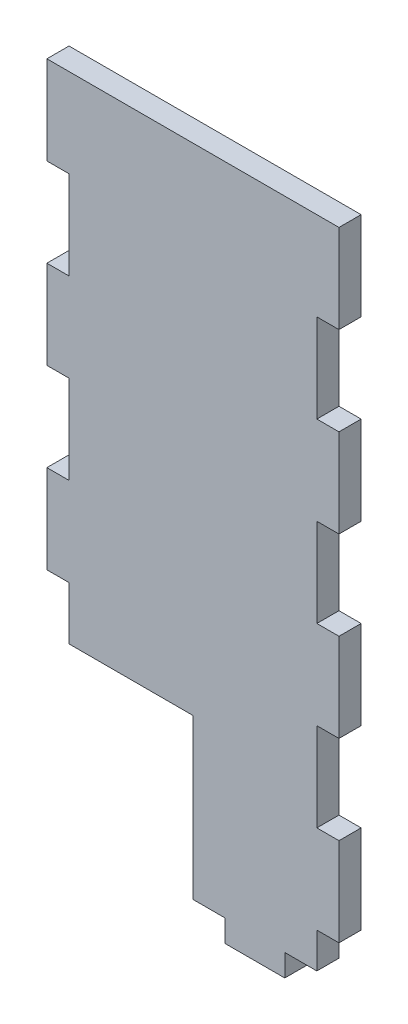
ISO-10303-21;
HEADER;
FILE_DESCRIPTION(('STEP AP214'),'2;1');
FILE_NAME('part.step','',(''),(''),'','','');
FILE_SCHEMA(('AUTOMOTIVE_DESIGN { 1 0 10303 214 1 1 1 1 }'));
ENDSEC;
DATA;
#1=APPLICATION_CONTEXT('core data for automotive mechanical design processes');
#2=APPLICATION_PROTOCOL_DEFINITION('international standard','automotive_design',2000,#1);
#3=PRODUCT_CONTEXT('',#1,'mechanical');
#4=PRODUCT('Part','Part','',(#3));
#5=PRODUCT_RELATED_PRODUCT_CATEGORY('part','',(#4));
#6=PRODUCT_DEFINITION_FORMATION('','',#4);
#7=PRODUCT_DEFINITION_CONTEXT('part definition',#1,'design');
#8=PRODUCT_DEFINITION('design','',#6,#7);
#9=PRODUCT_DEFINITION_SHAPE('','',#8);
#10=(LENGTH_UNIT() NAMED_UNIT(*) SI_UNIT(.MILLI.,.METRE.));
#11=(NAMED_UNIT(*) PLANE_ANGLE_UNIT() SI_UNIT($,.RADIAN.));
#12=(NAMED_UNIT(*) SI_UNIT($,.STERADIAN.) SOLID_ANGLE_UNIT());
#13=UNCERTAINTY_MEASURE_WITH_UNIT(LENGTH_MEASURE(1.E-05),#10,'distance_accuracy_value','');
#14=(GEOMETRIC_REPRESENTATION_CONTEXT(3) GLOBAL_UNCERTAINTY_ASSIGNED_CONTEXT((#13)) GLOBAL_UNIT_ASSIGNED_CONTEXT((#10,
#11,#12)) REPRESENTATION_CONTEXT('',''));
#15=CARTESIAN_POINT('',(0.,0.,0.));
#16=DIRECTION('',(0.,0.,1.));
#17=DIRECTION('',(1.,0.,0.));
#18=AXIS2_PLACEMENT_3D('',#15,#16,#17);
#19=CARTESIAN_POINT('',(35.56,0.,6.35));
#20=DIRECTION('',(1.,0.,0.));
#21=DIRECTION('',(0.,0.,-1.));
#22=AXIS2_PLACEMENT_3D('',#19,#20,#21);
#23=PLANE('',#22);
#24=DIRECTION('',(0.,-1.,0.));
#25=VECTOR('',#24,1.);
#26=CARTESIAN_POINT('',(35.56,0.,0.));
#27=LINE('',#26,#25);
#28=CARTESIAN_POINT('',(35.56,45.72,0.));
#29=VERTEX_POINT('',#28);
#30=CARTESIAN_POINT('',(35.56,20.32,0.));
#31=VERTEX_POINT('',#30);
#32=EDGE_CURVE('E305',#29,#31,#27,.T.);
#33=ORIENTED_EDGE('',*,*,#32,.F.);
#34=DIRECTION('',(0.,0.,-1.));
#35=VECTOR('',#34,1.);
#36=CARTESIAN_POINT('',(35.56,45.72,6.35));
#37=LINE('',#36,#35);
#38=CARTESIAN_POINT('',(35.56,45.72,6.35));
#39=VERTEX_POINT('',#38);
#40=EDGE_CURVE('E11',#39,#29,#37,.T.);
#41=ORIENTED_EDGE('',*,*,#40,.F.);
#42=DIRECTION('',(0.,-1.,0.));
#43=VECTOR('',#42,1.);
#44=CARTESIAN_POINT('',(35.56,0.,6.35));
#45=LINE('',#44,#43);
#46=CARTESIAN_POINT('',(35.56,20.32,6.35));
#47=VERTEX_POINT('',#46);
#48=EDGE_CURVE('E417',#39,#47,#45,.T.);
#49=ORIENTED_EDGE('',*,*,#48,.T.);
#50=DIRECTION('',(0.,0.,-1.));
#51=VECTOR('',#50,1.);
#52=CARTESIAN_POINT('',(35.56,20.32,6.35));
#53=LINE('',#52,#51);
#54=EDGE_CURVE('E67',#47,#31,#53,.T.);
#55=ORIENTED_EDGE('',*,*,#54,.T.);
#56=EDGE_LOOP('',(#33,#41,#49,#55));
#57=FACE_BOUND('',#56,.T.);
#58=ADVANCED_FACE('F49',(#57),#23,.T.);
#59=CARTESIAN_POINT('',(0.,45.72,6.35));
#60=DIRECTION('',(0.,1.,0.));
#61=DIRECTION('',(0.,0.,1.));
#62=AXIS2_PLACEMENT_3D('',#59,#60,#61);
#63=PLANE('',#62);
#64=DIRECTION('',(1.,0.,0.));
#65=VECTOR('',#64,1.);
#66=CARTESIAN_POINT('',(0.,45.72,0.));
#67=LINE('',#66,#65);
#68=CARTESIAN_POINT('',(41.91,45.72,0.));
#69=VERTEX_POINT('',#68);
#70=EDGE_CURVE('E308',#29,#69,#67,.T.);
#71=ORIENTED_EDGE('',*,*,#70,.T.);
#72=DIRECTION('',(0.,0.,-1.));
#73=VECTOR('',#72,1.);
#74=CARTESIAN_POINT('',(41.91,45.72,6.35));
#75=LINE('',#74,#73);
#76=CARTESIAN_POINT('',(41.91,45.72,6.35));
#77=VERTEX_POINT('',#76);
#78=EDGE_CURVE('E59',#77,#69,#75,.T.);
#79=ORIENTED_EDGE('',*,*,#78,.F.);
#80=DIRECTION('',(1.,0.,0.));
#81=VECTOR('',#80,1.);
#82=CARTESIAN_POINT('',(0.,45.72,6.35));
#83=LINE('',#82,#81);
#84=EDGE_CURVE('E534',#39,#77,#83,.T.);
#85=ORIENTED_EDGE('',*,*,#84,.F.);
#86=ORIENTED_EDGE('',*,*,#40,.T.);
#87=EDGE_LOOP('',(#71,#79,#85,#86));
#88=FACE_BOUND('',#87,.T.);
#89=ADVANCED_FACE('F51',(#88),#63,.F.);
#90=CARTESIAN_POINT('',(41.91,0.,6.35));
#91=DIRECTION('',(1.,0.,0.));
#92=DIRECTION('',(0.,1.,0.));
#93=AXIS2_PLACEMENT_3D('',#90,#91,#92);
#94=PLANE('',#93);
#95=DIRECTION('',(0.,-1.,0.));
#96=VECTOR('',#95,1.);
#97=CARTESIAN_POINT('',(41.91,0.,0.));
#98=LINE('',#97,#96);
#99=CARTESIAN_POINT('',(41.91,71.12,0.));
#100=VERTEX_POINT('',#99);
#101=EDGE_CURVE('E313',#100,#69,#98,.T.);
#102=ORIENTED_EDGE('',*,*,#101,.F.);
#103=DIRECTION('',(0.,0.,-1.));
#104=VECTOR('',#103,1.);
#105=CARTESIAN_POINT('',(41.91,71.12,6.35));
#106=LINE('',#105,#104);
#107=CARTESIAN_POINT('',(41.91,71.12,6.35));
#108=VERTEX_POINT('',#107);
#109=EDGE_CURVE('E512',#108,#100,#106,.T.);
#110=ORIENTED_EDGE('',*,*,#109,.F.);
#111=DIRECTION('',(0.,-1.,0.));
#112=VECTOR('',#111,1.);
#113=CARTESIAN_POINT('',(41.91,0.,6.35));
#114=LINE('',#113,#112);
#115=EDGE_CURVE('E521',#108,#77,#114,.T.);
#116=ORIENTED_EDGE('',*,*,#115,.T.);
#117=ORIENTED_EDGE('',*,*,#78,.T.);
#118=EDGE_LOOP('',(#102,#110,#116,#117));
#119=FACE_BOUND('',#118,.T.);
#120=ADVANCED_FACE('F519',(#119),#94,.T.);
#121=CARTESIAN_POINT('',(0.,71.12,6.35));
#122=DIRECTION('',(0.,1.,0.));
#123=DIRECTION('',(0.,0.,1.));
#124=AXIS2_PLACEMENT_3D('',#121,#122,#123);
#125=PLANE('',#124);
#126=DIRECTION('',(1.,0.,0.));
#127=VECTOR('',#126,1.);
#128=CARTESIAN_POINT('',(0.,71.12,0.));
#129=LINE('',#128,#127);
#130=CARTESIAN_POINT('',(-41.91,71.12,0.));
#131=VERTEX_POINT('',#130);
#132=EDGE_CURVE('E317',#131,#100,#129,.T.);
#133=ORIENTED_EDGE('',*,*,#132,.F.);
#134=DIRECTION('',(0.,0.,-1.));
#135=VECTOR('',#134,1.);
#136=CARTESIAN_POINT('',(-41.91,71.12,6.35));
#137=LINE('',#136,#135);
#138=CARTESIAN_POINT('',(-41.91,71.12,6.35));
#139=VERTEX_POINT('',#138);
#140=EDGE_CURVE('E509',#139,#131,#137,.T.);
#141=ORIENTED_EDGE('',*,*,#140,.F.);
#142=DIRECTION('',(1.,0.,0.));
#143=VECTOR('',#142,1.);
#144=CARTESIAN_POINT('',(0.,71.12,6.35));
#145=LINE('',#144,#143);
#146=EDGE_CURVE('E533',#139,#108,#145,.T.);
#147=ORIENTED_EDGE('',*,*,#146,.T.);
#148=ORIENTED_EDGE('',*,*,#109,.T.);
#149=EDGE_LOOP('',(#133,#141,#147,#148));
#150=FACE_BOUND('',#149,.T.);
#151=ADVANCED_FACE('F529',(#150),#125,.T.);
#152=CARTESIAN_POINT('',(-41.91,0.,6.35));
#153=DIRECTION('',(1.,0.,0.));
#154=DIRECTION('',(0.,0.,-1.));
#155=AXIS2_PLACEMENT_3D('',#152,#153,#154);
#156=PLANE('',#155);
#157=DIRECTION('',(0.,-1.,0.));
#158=VECTOR('',#157,1.);
#159=CARTESIAN_POINT('',(-41.91,0.,0.));
#160=LINE('',#159,#158);
#161=CARTESIAN_POINT('',(-41.91,45.72,0.));
#162=VERTEX_POINT('',#161);
#163=EDGE_CURVE('E321',#131,#162,#160,.T.);
#164=ORIENTED_EDGE('',*,*,#163,.T.);
#165=DIRECTION('',(0.,0.,-1.));
#166=VECTOR('',#165,1.);
#167=CARTESIAN_POINT('',(-41.91,45.72,6.35));
#168=LINE('',#167,#166);
#169=CARTESIAN_POINT('',(-41.91,45.72,6.35));
#170=VERTEX_POINT('',#169);
#171=EDGE_CURVE('E506',#170,#162,#168,.T.);
#172=ORIENTED_EDGE('',*,*,#171,.F.);
#173=DIRECTION('',(0.,-1.,0.));
#174=VECTOR('',#173,1.);
#175=CARTESIAN_POINT('',(-41.91,0.,6.35));
#176=LINE('',#175,#174);
#177=EDGE_CURVE('E539',#139,#170,#176,.T.);
#178=ORIENTED_EDGE('',*,*,#177,.F.);
#179=ORIENTED_EDGE('',*,*,#140,.T.);
#180=EDGE_LOOP('',(#164,#172,#178,#179));
#181=FACE_BOUND('',#180,.T.);
#182=ADVANCED_FACE('F799',(#181),#156,.F.);
#183=CARTESIAN_POINT('',(0.,45.72,6.35));
#184=DIRECTION('',(0.,-1.,0.));
#185=DIRECTION('',(0.,0.,-1.));
#186=AXIS2_PLACEMENT_3D('',#183,#184,#185);
#187=PLANE('',#186);
#188=DIRECTION('',(-1.,0.,0.));
#189=VECTOR('',#188,1.);
#190=CARTESIAN_POINT('',(0.,45.72,0.));
#191=LINE('',#190,#189);
#192=CARTESIAN_POINT('',(-35.56,45.72,0.));
#193=VERTEX_POINT('',#192);
#194=EDGE_CURVE('E325',#193,#162,#191,.T.);
#195=ORIENTED_EDGE('',*,*,#194,.F.);
#196=DIRECTION('',(0.,0.,-1.));
#197=VECTOR('',#196,1.);
#198=CARTESIAN_POINT('',(-35.56,45.72,6.35));
#199=LINE('',#198,#197);
#200=CARTESIAN_POINT('',(-35.56,45.72,6.35));
#201=VERTEX_POINT('',#200);
#202=EDGE_CURVE('E503',#201,#193,#199,.T.);
#203=ORIENTED_EDGE('',*,*,#202,.F.);
#204=DIRECTION('',(-1.,0.,0.));
#205=VECTOR('',#204,1.);
#206=CARTESIAN_POINT('',(0.,45.72,6.35));
#207=LINE('',#206,#205);
#208=EDGE_CURVE('E546',#201,#170,#207,.T.);
#209=ORIENTED_EDGE('',*,*,#208,.T.);
#210=ORIENTED_EDGE('',*,*,#171,.T.);
#211=EDGE_LOOP('',(#195,#203,#209,#210));
#212=FACE_BOUND('',#211,.T.);
#213=ADVANCED_FACE('F796',(#212),#187,.T.);
#214=CARTESIAN_POINT('',(-35.56,0.,6.35));
#215=DIRECTION('',(1.,0.,0.));
#216=DIRECTION('',(0.,1.,0.));
#217=AXIS2_PLACEMENT_3D('',#214,#215,#216);
#218=PLANE('',#217);
#219=DIRECTION('',(0.,-1.,0.));
#220=VECTOR('',#219,1.);
#221=CARTESIAN_POINT('',(-35.56,0.,0.));
#222=LINE('',#221,#220);
#223=CARTESIAN_POINT('',(-35.56,20.32,0.));
#224=VERTEX_POINT('',#223);
#225=EDGE_CURVE('E329',#193,#224,#222,.T.);
#226=ORIENTED_EDGE('',*,*,#225,.T.);
#227=DIRECTION('',(0.,0.,-1.));
#228=VECTOR('',#227,1.);
#229=CARTESIAN_POINT('',(-35.56,20.32,6.35));
#230=LINE('',#229,#228);
#231=CARTESIAN_POINT('',(-35.56,20.32,6.35));
#232=VERTEX_POINT('',#231);
#233=EDGE_CURVE('E499',#232,#224,#230,.T.);
#234=ORIENTED_EDGE('',*,*,#233,.F.);
#235=DIRECTION('',(0.,-1.,0.));
#236=VECTOR('',#235,1.);
#237=CARTESIAN_POINT('',(-35.56,0.,6.35));
#238=LINE('',#237,#236);
#239=EDGE_CURVE('E550',#201,#232,#238,.T.);
#240=ORIENTED_EDGE('',*,*,#239,.F.);
#241=ORIENTED_EDGE('',*,*,#202,.T.);
#242=EDGE_LOOP('',(#226,#234,#240,#241));
#243=FACE_BOUND('',#242,.T.);
#244=ADVANCED_FACE('F776',(#243),#218,.F.);
#245=CARTESIAN_POINT('',(0.,20.32,6.35));
#246=DIRECTION('',(0.,-1.,0.));
#247=DIRECTION('',(0.,0.,-1.));
#248=AXIS2_PLACEMENT_3D('',#245,#246,#247);
#249=PLANE('',#248);
#250=DIRECTION('',(-1.,0.,0.));
#251=VECTOR('',#250,1.);
#252=CARTESIAN_POINT('',(0.,20.32,0.));
#253=LINE('',#252,#251);
#254=CARTESIAN_POINT('',(-41.91,20.32,0.));
#255=VERTEX_POINT('',#254);
#256=EDGE_CURVE('E332',#224,#255,#253,.T.);
#257=ORIENTED_EDGE('',*,*,#256,.T.);
#258=DIRECTION('',(0.,0.,-1.));
#259=VECTOR('',#258,1.);
#260=CARTESIAN_POINT('',(-41.91,20.32,6.35));
#261=LINE('',#260,#259);
#262=CARTESIAN_POINT('',(-41.91,20.32,6.35));
#263=VERTEX_POINT('',#262);
#264=EDGE_CURVE('E495',#263,#255,#261,.T.);
#265=ORIENTED_EDGE('',*,*,#264,.F.);
#266=DIRECTION('',(-1.,0.,0.));
#267=VECTOR('',#266,1.);
#268=CARTESIAN_POINT('',(0.,20.32,6.35));
#269=LINE('',#268,#267);
#270=EDGE_CURVE('E553',#232,#263,#269,.T.);
#271=ORIENTED_EDGE('',*,*,#270,.F.);
#272=ORIENTED_EDGE('',*,*,#233,.T.);
#273=EDGE_LOOP('',(#257,#265,#271,#272));
#274=FACE_BOUND('',#273,.T.);
#275=ADVANCED_FACE('F791',(#274),#249,.F.);
#276=CARTESIAN_POINT('',(-41.91,0.,6.35));
#277=DIRECTION('',(1.,0.,0.));
#278=DIRECTION('',(0.,0.,-1.));
#279=AXIS2_PLACEMENT_3D('',#276,#277,#278);
#280=PLANE('',#279);
#281=DIRECTION('',(0.,-1.,0.));
#282=VECTOR('',#281,1.);
#283=CARTESIAN_POINT('',(-41.91,0.,0.));
#284=LINE('',#283,#282);
#285=CARTESIAN_POINT('',(-41.91,-5.08,0.));
#286=VERTEX_POINT('',#285);
#287=EDGE_CURVE('E337',#255,#286,#284,.T.);
#288=ORIENTED_EDGE('',*,*,#287,.T.);
#289=DIRECTION('',(0.,0.,-1.));
#290=VECTOR('',#289,1.);
#291=CARTESIAN_POINT('',(-41.91,-5.08,6.35));
#292=LINE('',#291,#290);
#293=CARTESIAN_POINT('',(-41.91,-5.08,6.35));
#294=VERTEX_POINT('',#293);
#295=EDGE_CURVE('E492',#294,#286,#292,.T.);
#296=ORIENTED_EDGE('',*,*,#295,.F.);
#297=DIRECTION('',(0.,-1.,0.));
#298=VECTOR('',#297,1.);
#299=CARTESIAN_POINT('',(-41.91,0.,6.35));
#300=LINE('',#299,#298);
#301=EDGE_CURVE('E558',#263,#294,#300,.T.);
#302=ORIENTED_EDGE('',*,*,#301,.F.);
#303=ORIENTED_EDGE('',*,*,#264,.T.);
#304=EDGE_LOOP('',(#288,#296,#302,#303));
#305=FACE_BOUND('',#304,.T.);
#306=ADVANCED_FACE('F787',(#305),#280,.F.);
#307=CARTESIAN_POINT('',(0.,-5.08,6.35));
#308=DIRECTION('',(0.,-1.,0.));
#309=DIRECTION('',(0.,0.,-1.));
#310=AXIS2_PLACEMENT_3D('',#307,#308,#309);
#311=PLANE('',#310);
#312=DIRECTION('',(-1.,0.,0.));
#313=VECTOR('',#312,1.);
#314=CARTESIAN_POINT('',(0.,-5.08,0.));
#315=LINE('',#314,#313);
#316=CARTESIAN_POINT('',(-35.56,-5.08,0.));
#317=VERTEX_POINT('',#316);
#318=EDGE_CURVE('E341',#317,#286,#315,.T.);
#319=ORIENTED_EDGE('',*,*,#318,.F.);
#320=DIRECTION('',(0.,0.,-1.));
#321=VECTOR('',#320,1.);
#322=CARTESIAN_POINT('',(-35.56,-5.08,6.35));
#323=LINE('',#322,#321);
#324=CARTESIAN_POINT('',(-35.56,-5.08,6.35));
#325=VERTEX_POINT('',#324);
#326=EDGE_CURVE('E489',#325,#317,#323,.T.);
#327=ORIENTED_EDGE('',*,*,#326,.F.);
#328=DIRECTION('',(-1.,0.,0.));
#329=VECTOR('',#328,1.);
#330=CARTESIAN_POINT('',(0.,-5.08,6.35));
#331=LINE('',#330,#329);
#332=EDGE_CURVE('E561',#325,#294,#331,.T.);
#333=ORIENTED_EDGE('',*,*,#332,.T.);
#334=ORIENTED_EDGE('',*,*,#295,.T.);
#335=EDGE_LOOP('',(#319,#327,#333,#334));
#336=FACE_BOUND('',#335,.T.);
#337=ADVANCED_FACE('F784',(#336),#311,.T.);
#338=CARTESIAN_POINT('',(-35.56,-30.48,0.));
#339=VERTEX_POINT('',#338);
#340=EDGE_CURVE('E334',#317,#339,#222,.T.);
#341=ORIENTED_EDGE('',*,*,#340,.T.);
#342=DIRECTION('',(0.,0.,-1.));
#343=VECTOR('',#342,1.);
#344=CARTESIAN_POINT('',(-35.56,-30.48,6.35));
#345=LINE('',#344,#343);
#346=CARTESIAN_POINT('',(-35.56,-30.48,6.35));
#347=VERTEX_POINT('',#346);
#348=EDGE_CURVE('E485',#347,#339,#345,.T.);
#349=ORIENTED_EDGE('',*,*,#348,.F.);
#350=EDGE_CURVE('E555',#325,#347,#238,.T.);
#351=ORIENTED_EDGE('',*,*,#350,.F.);
#352=ORIENTED_EDGE('',*,*,#326,.T.);
#353=EDGE_LOOP('',(#341,#349,#351,#352));
#354=FACE_BOUND('',#353,.T.);
#355=ADVANCED_FACE('F663',(#354),#218,.F.);
#356=CARTESIAN_POINT('',(0.,-30.48,6.35));
#357=DIRECTION('',(0.,-1.,0.));
#358=DIRECTION('',(0.,0.,-1.));
#359=AXIS2_PLACEMENT_3D('',#356,#357,#358);
#360=PLANE('',#359);
#361=DIRECTION('',(-1.,0.,0.));
#362=VECTOR('',#361,1.);
#363=CARTESIAN_POINT('',(0.,-30.48,0.));
#364=LINE('',#363,#362);
#365=CARTESIAN_POINT('',(-41.91,-30.48,0.));
#366=VERTEX_POINT('',#365);
#367=EDGE_CURVE('E345',#339,#366,#364,.T.);
#368=ORIENTED_EDGE('',*,*,#367,.T.);
#369=DIRECTION('',(0.,0.,-1.));
#370=VECTOR('',#369,1.);
#371=CARTESIAN_POINT('',(-41.91,-30.48,6.35));
#372=LINE('',#371,#370);
#373=CARTESIAN_POINT('',(-41.91,-30.48,6.35));
#374=VERTEX_POINT('',#373);
#375=EDGE_CURVE('E481',#374,#366,#372,.T.);
#376=ORIENTED_EDGE('',*,*,#375,.F.);
#377=DIRECTION('',(-1.,0.,0.));
#378=VECTOR('',#377,1.);
#379=CARTESIAN_POINT('',(0.,-30.48,6.35));
#380=LINE('',#379,#378);
#381=EDGE_CURVE('E565',#347,#374,#380,.T.);
#382=ORIENTED_EDGE('',*,*,#381,.F.);
#383=ORIENTED_EDGE('',*,*,#348,.T.);
#384=EDGE_LOOP('',(#368,#376,#382,#383));
#385=FACE_BOUND('',#384,.T.);
#386=ADVANCED_FACE('F669',(#385),#360,.F.);
#387=CARTESIAN_POINT('',(-41.91,0.,6.35));
#388=DIRECTION('',(1.,0.,0.));
#389=DIRECTION('',(0.,0.,-1.));
#390=AXIS2_PLACEMENT_3D('',#387,#388,#389);
#391=PLANE('',#390);
#392=DIRECTION('',(0.,-1.,0.));
#393=VECTOR('',#392,1.);
#394=CARTESIAN_POINT('',(-41.91,0.,0.));
#395=LINE('',#394,#393);
#396=CARTESIAN_POINT('',(-41.91,-55.88,0.));
#397=VERTEX_POINT('',#396);
#398=EDGE_CURVE('E348',#366,#397,#395,.T.);
#399=ORIENTED_EDGE('',*,*,#398,.T.);
#400=DIRECTION('',(0.,0.,-1.));
#401=VECTOR('',#400,1.);
#402=CARTESIAN_POINT('',(-41.91,-55.88,6.35));
#403=LINE('',#402,#401);
#404=CARTESIAN_POINT('',(-41.91,-55.88,6.35));
#405=VERTEX_POINT('',#404);
#406=EDGE_CURVE('E478',#405,#397,#403,.T.);
#407=ORIENTED_EDGE('',*,*,#406,.F.);
#408=DIRECTION('',(0.,-1.,0.));
#409=VECTOR('',#408,1.);
#410=CARTESIAN_POINT('',(-41.91,0.,6.35));
#411=LINE('',#410,#409);
#412=EDGE_CURVE('E568',#374,#405,#411,.T.);
#413=ORIENTED_EDGE('',*,*,#412,.F.);
#414=ORIENTED_EDGE('',*,*,#375,.T.);
#415=EDGE_LOOP('',(#399,#407,#413,#414));
#416=FACE_BOUND('',#415,.T.);
#417=ADVANCED_FACE('F676',(#416),#391,.F.);
#418=CARTESIAN_POINT('',(0.,-55.88,6.35));
#419=DIRECTION('',(0.,-1.,0.));
#420=DIRECTION('',(0.,0.,-1.));
#421=AXIS2_PLACEMENT_3D('',#418,#419,#420);
#422=PLANE('',#421);
#423=DIRECTION('',(-1.,0.,0.));
#424=VECTOR('',#423,1.);
#425=CARTESIAN_POINT('',(0.,-55.88,0.));
#426=LINE('',#425,#424);
#427=CARTESIAN_POINT('',(-35.56,-55.88,0.));
#428=VERTEX_POINT('',#427);
#429=EDGE_CURVE('E352',#428,#397,#426,.T.);
#430=ORIENTED_EDGE('',*,*,#429,.F.);
#431=DIRECTION('',(0.,0.,-1.));
#432=VECTOR('',#431,1.);
#433=CARTESIAN_POINT('',(-35.56,-55.88,6.35));
#434=LINE('',#433,#432);
#435=CARTESIAN_POINT('',(-35.56,-55.88,6.35));
#436=VERTEX_POINT('',#435);
#437=EDGE_CURVE('E475',#436,#428,#434,.T.);
#438=ORIENTED_EDGE('',*,*,#437,.F.);
#439=DIRECTION('',(-1.,0.,0.));
#440=VECTOR('',#439,1.);
#441=CARTESIAN_POINT('',(0.,-55.88,6.35));
#442=LINE('',#441,#440);
#443=EDGE_CURVE('E571',#436,#405,#442,.T.);
#444=ORIENTED_EDGE('',*,*,#443,.T.);
#445=ORIENTED_EDGE('',*,*,#406,.T.);
#446=EDGE_LOOP('',(#430,#438,#444,#445));
#447=FACE_BOUND('',#446,.T.);
#448=ADVANCED_FACE('F775',(#447),#422,.T.);
#449=CARTESIAN_POINT('',(-35.56,-71.12,0.));
#450=VERTEX_POINT('',#449);
#451=EDGE_CURVE('E333',#428,#450,#222,.T.);
#452=ORIENTED_EDGE('',*,*,#451,.T.);
#453=DIRECTION('',(0.,0.,-1.));
#454=VECTOR('',#453,1.);
#455=CARTESIAN_POINT('',(-35.56,-71.12,6.35));
#456=LINE('',#455,#454);
#457=CARTESIAN_POINT('',(-35.56,-71.12,6.35));
#458=VERTEX_POINT('',#457);
#459=EDGE_CURVE('E471',#458,#450,#456,.T.);
#460=ORIENTED_EDGE('',*,*,#459,.F.);
#461=EDGE_CURVE('E554',#436,#458,#238,.T.);
#462=ORIENTED_EDGE('',*,*,#461,.F.);
#463=ORIENTED_EDGE('',*,*,#437,.T.);
#464=EDGE_LOOP('',(#452,#460,#462,#463));
#465=FACE_BOUND('',#464,.T.);
#466=ADVANCED_FACE('F687',(#465),#218,.F.);
#467=CARTESIAN_POINT('',(0.,-71.12,6.35));
#468=DIRECTION('',(0.,1.,0.));
#469=DIRECTION('',(0.,0.,1.));
#470=AXIS2_PLACEMENT_3D('',#467,#468,#469);
#471=PLANE('',#470);
#472=DIRECTION('',(1.,0.,0.));
#473=VECTOR('',#472,1.);
#474=CARTESIAN_POINT('',(0.,-71.12,0.));
#475=LINE('',#474,#473);
#476=CARTESIAN_POINT('',(0.,-71.12,0.));
#477=VERTEX_POINT('',#476);
#478=EDGE_CURVE('E356',#450,#477,#475,.T.);
#479=ORIENTED_EDGE('',*,*,#478,.T.);
#480=DIRECTION('',(0.,0.,-1.));
#481=VECTOR('',#480,1.);
#482=CARTESIAN_POINT('',(0.,-71.12,6.35));
#483=LINE('',#482,#481);
#484=CARTESIAN_POINT('',(0.,-71.12,6.35));
#485=VERTEX_POINT('',#484);
#486=EDGE_CURVE('E467',#485,#477,#483,.T.);
#487=ORIENTED_EDGE('',*,*,#486,.F.);
#488=DIRECTION('',(1.,0.,0.));
#489=VECTOR('',#488,1.);
#490=CARTESIAN_POINT('',(0.,-71.12,6.35));
#491=LINE('',#490,#489);
#492=EDGE_CURVE('E575',#458,#485,#491,.T.);
#493=ORIENTED_EDGE('',*,*,#492,.F.);
#494=ORIENTED_EDGE('',*,*,#459,.T.);
#495=EDGE_LOOP('',(#479,#487,#493,#494));
#496=FACE_BOUND('',#495,.T.);
#497=ADVANCED_FACE('F690',(#496),#471,.F.);
#498=CARTESIAN_POINT('',(0.,0.,6.35));
#499=DIRECTION('',(1.,0.,0.));
#500=DIRECTION('',(0.,0.,-1.));
#501=AXIS2_PLACEMENT_3D('',#498,#499,#500);
#502=PLANE('',#501);
#503=DIRECTION('',(0.,-1.,0.));
#504=VECTOR('',#503,1.);
#505=CARTESIAN_POINT('',(0.,0.,0.));
#506=LINE('',#505,#504);
#507=CARTESIAN_POINT('',(0.,-116.84,0.));
#508=VERTEX_POINT('',#507);
#509=EDGE_CURVE('E359',#477,#508,#506,.T.);
#510=ORIENTED_EDGE('',*,*,#509,.T.);
#511=DIRECTION('',(0.,0.,-1.));
#512=VECTOR('',#511,1.);
#513=CARTESIAN_POINT('',(0.,-116.84,6.35));
#514=LINE('',#513,#512);
#515=CARTESIAN_POINT('',(0.,-116.84,6.35));
#516=VERTEX_POINT('',#515);
#517=EDGE_CURVE('E464',#516,#508,#514,.T.);
#518=ORIENTED_EDGE('',*,*,#517,.F.);
#519=DIRECTION('',(0.,-1.,0.));
#520=VECTOR('',#519,1.);
#521=CARTESIAN_POINT('',(0.,0.,6.35));
#522=LINE('',#521,#520);
#523=EDGE_CURVE('E578',#485,#516,#522,.T.);
#524=ORIENTED_EDGE('',*,*,#523,.F.);
#525=ORIENTED_EDGE('',*,*,#486,.T.);
#526=EDGE_LOOP('',(#510,#518,#524,#525));
#527=FACE_BOUND('',#526,.T.);
#528=ADVANCED_FACE('F695',(#527),#502,.F.);
#529=CARTESIAN_POINT('',(0.,-116.84,6.35));
#530=DIRECTION('',(0.,-1.,0.));
#531=DIRECTION('',(1.,0.,0.));
#532=AXIS2_PLACEMENT_3D('',#529,#530,#531);
#533=PLANE('',#532);
#534=DIRECTION('',(-1.,0.,0.));
#535=VECTOR('',#534,1.);
#536=CARTESIAN_POINT('',(0.,-116.84,0.));
#537=LINE('',#536,#535);
#538=CARTESIAN_POINT('',(9.20749999999999,-116.84,0.));
#539=VERTEX_POINT('',#538);
#540=EDGE_CURVE('E363',#539,#508,#537,.T.);
#541=ORIENTED_EDGE('',*,*,#540,.F.);
#542=DIRECTION('',(0.,0.,-1.));
#543=VECTOR('',#542,1.);
#544=CARTESIAN_POINT('',(9.20749999999999,-116.84,6.35));
#545=LINE('',#544,#543);
#546=CARTESIAN_POINT('',(9.20749999999999,-116.84,6.35));
#547=VERTEX_POINT('',#546);
#548=EDGE_CURVE('E461',#547,#539,#545,.T.);
#549=ORIENTED_EDGE('',*,*,#548,.F.);
#550=DIRECTION('',(-1.,0.,0.));
#551=VECTOR('',#550,1.);
#552=CARTESIAN_POINT('',(0.,-116.84,6.35));
#553=LINE('',#552,#551);
#554=EDGE_CURVE('E581',#547,#516,#553,.T.);
#555=ORIENTED_EDGE('',*,*,#554,.T.);
#556=ORIENTED_EDGE('',*,*,#517,.T.);
#557=EDGE_LOOP('',(#541,#549,#555,#556));
#558=FACE_BOUND('',#557,.T.);
#559=ADVANCED_FACE('F701',(#558),#533,.T.);
#560=CARTESIAN_POINT('',(9.20749999999999,0.,6.35));
#561=DIRECTION('',(1.,0.,0.));
#562=DIRECTION('',(0.,0.,-1.));
#563=AXIS2_PLACEMENT_3D('',#560,#561,#562);
#564=PLANE('',#563);
#565=DIRECTION('',(0.,-1.,0.));
#566=VECTOR('',#565,1.);
#567=CARTESIAN_POINT('',(9.20749999999999,0.,0.));
#568=LINE('',#567,#566);
#569=CARTESIAN_POINT('',(9.20749999999999,-123.19,0.));
#570=VERTEX_POINT('',#569);
#571=EDGE_CURVE('E367',#539,#570,#568,.T.);
#572=ORIENTED_EDGE('',*,*,#571,.T.);
#573=DIRECTION('',(0.,0.,-1.));
#574=VECTOR('',#573,1.);
#575=CARTESIAN_POINT('',(9.20749999999999,-123.19,6.35));
#576=LINE('',#575,#574);
#577=CARTESIAN_POINT('',(9.20749999999999,-123.19,6.35));
#578=VERTEX_POINT('',#577);
#579=EDGE_CURVE('E457',#578,#570,#576,.T.);
#580=ORIENTED_EDGE('',*,*,#579,.F.);
#581=DIRECTION('',(0.,-1.,0.));
#582=VECTOR('',#581,1.);
#583=CARTESIAN_POINT('',(9.20749999999999,0.,6.35));
#584=LINE('',#583,#582);
#585=EDGE_CURVE('E585',#547,#578,#584,.T.);
#586=ORIENTED_EDGE('',*,*,#585,.F.);
#587=ORIENTED_EDGE('',*,*,#548,.T.);
#588=EDGE_LOOP('',(#572,#580,#586,#587));
#589=FACE_BOUND('',#588,.T.);
#590=ADVANCED_FACE('F704',(#589),#564,.F.);
#591=CARTESIAN_POINT('',(0.,-123.19,6.35));
#592=DIRECTION('',(0.,1.,0.));
#593=DIRECTION('',(0.,0.,1.));
#594=AXIS2_PLACEMENT_3D('',#591,#592,#593);
#595=PLANE('',#594);
#596=DIRECTION('',(1.,0.,0.));
#597=VECTOR('',#596,1.);
#598=CARTESIAN_POINT('',(0.,-123.19,0.));
#599=LINE('',#598,#597);
#600=CARTESIAN_POINT('',(26.3525,-123.19,0.));
#601=VERTEX_POINT('',#600);
#602=EDGE_CURVE('E371',#570,#601,#599,.T.);
#603=ORIENTED_EDGE('',*,*,#602,.T.);
#604=DIRECTION('',(0.,0.,-1.));
#605=VECTOR('',#604,1.);
#606=CARTESIAN_POINT('',(26.3525,-123.19,6.35));
#607=LINE('',#606,#605);
#608=CARTESIAN_POINT('',(26.3525,-123.19,6.35));
#609=VERTEX_POINT('',#608);
#610=EDGE_CURVE('E454',#609,#601,#607,.T.);
#611=ORIENTED_EDGE('',*,*,#610,.F.);
#612=DIRECTION('',(1.,0.,0.));
#613=VECTOR('',#612,1.);
#614=CARTESIAN_POINT('',(0.,-123.19,6.35));
#615=LINE('',#614,#613);
#616=EDGE_CURVE('E589',#578,#609,#615,.T.);
#617=ORIENTED_EDGE('',*,*,#616,.F.);
#618=ORIENTED_EDGE('',*,*,#579,.T.);
#619=EDGE_LOOP('',(#603,#611,#617,#618));
#620=FACE_BOUND('',#619,.T.);
#621=ADVANCED_FACE('F709',(#620),#595,.F.);
#622=CARTESIAN_POINT('',(26.3524999999999,0.,6.35));
#623=DIRECTION('',(1.,0.,0.));
#624=DIRECTION('',(0.,1.,0.));
#625=AXIS2_PLACEMENT_3D('',#622,#623,#624);
#626=PLANE('',#625);
#627=DIRECTION('',(0.,-1.,0.));
#628=VECTOR('',#627,1.);
#629=CARTESIAN_POINT('',(26.3524999999999,0.,0.));
#630=LINE('',#629,#628);
#631=CARTESIAN_POINT('',(26.3525,-116.84,0.));
#632=VERTEX_POINT('',#631);
#633=EDGE_CURVE('E375',#632,#601,#630,.T.);
#634=ORIENTED_EDGE('',*,*,#633,.F.);
#635=DIRECTION('',(0.,0.,-1.));
#636=VECTOR('',#635,1.);
#637=CARTESIAN_POINT('',(26.3525,-116.84,6.35));
#638=LINE('',#637,#636);
#639=CARTESIAN_POINT('',(26.3525,-116.84,6.35));
#640=VERTEX_POINT('',#639);
#641=EDGE_CURVE('E451',#640,#632,#638,.T.);
#642=ORIENTED_EDGE('',*,*,#641,.F.);
#643=DIRECTION('',(0.,-1.,0.));
#644=VECTOR('',#643,1.);
#645=CARTESIAN_POINT('',(26.3524999999999,0.,6.35));
#646=LINE('',#645,#644);
#647=EDGE_CURVE('E592',#640,#609,#646,.T.);
#648=ORIENTED_EDGE('',*,*,#647,.T.);
#649=ORIENTED_EDGE('',*,*,#610,.T.);
#650=EDGE_LOOP('',(#634,#642,#648,#649));
#651=FACE_BOUND('',#650,.T.);
#652=ADVANCED_FACE('F762',(#651),#626,.T.);
#653=CARTESIAN_POINT('',(35.56,-116.84,0.));
#654=VERTEX_POINT('',#653);
#655=EDGE_CURVE('E368',#654,#632,#537,.T.);
#656=ORIENTED_EDGE('',*,*,#655,.F.);
#657=DIRECTION('',(0.,0.,-1.));
#658=VECTOR('',#657,1.);
#659=CARTESIAN_POINT('',(35.56,-116.84,6.35));
#660=LINE('',#659,#658);
#661=CARTESIAN_POINT('',(35.56,-116.84,6.35));
#662=VERTEX_POINT('',#661);
#663=EDGE_CURVE('E448',#662,#654,#660,.T.);
#664=ORIENTED_EDGE('',*,*,#663,.F.);
#665=EDGE_CURVE('E586',#662,#640,#553,.T.);
#666=ORIENTED_EDGE('',*,*,#665,.T.);
#667=ORIENTED_EDGE('',*,*,#641,.T.);
#668=EDGE_LOOP('',(#656,#664,#666,#667));
#669=FACE_BOUND('',#668,.T.);
#670=ADVANCED_FACE('F717',(#669),#533,.T.);
#671=CARTESIAN_POINT('',(35.5599999999999,0.,6.35));
#672=DIRECTION('',(1.,0.,0.));
#673=DIRECTION('',(0.,1.,0.));
#674=AXIS2_PLACEMENT_3D('',#671,#672,#673);
#675=PLANE('',#674);
#676=DIRECTION('',(0.,-1.,0.));
#677=VECTOR('',#676,1.);
#678=CARTESIAN_POINT('',(35.5599999999999,0.,0.));
#679=LINE('',#678,#677);
#680=CARTESIAN_POINT('',(35.56,-106.68,0.));
#681=VERTEX_POINT('',#680);
#682=EDGE_CURVE('E379',#681,#654,#679,.T.);
#683=ORIENTED_EDGE('',*,*,#682,.F.);
#684=DIRECTION('',(0.,0.,-1.));
#685=VECTOR('',#684,1.);
#686=CARTESIAN_POINT('',(35.56,-106.68,6.35));
#687=LINE('',#686,#685);
#688=CARTESIAN_POINT('',(35.56,-106.68,6.35));
#689=VERTEX_POINT('',#688);
#690=EDGE_CURVE('E445',#689,#681,#687,.T.);
#691=ORIENTED_EDGE('',*,*,#690,.F.);
#692=DIRECTION('',(0.,-1.,0.));
#693=VECTOR('',#692,1.);
#694=CARTESIAN_POINT('',(35.5599999999999,0.,6.35));
#695=LINE('',#694,#693);
#696=EDGE_CURVE('E596',#689,#662,#695,.T.);
#697=ORIENTED_EDGE('',*,*,#696,.T.);
#698=ORIENTED_EDGE('',*,*,#663,.T.);
#699=EDGE_LOOP('',(#683,#691,#697,#698));
#700=FACE_BOUND('',#699,.T.);
#701=ADVANCED_FACE('F749',(#700),#675,.T.);
#702=CARTESIAN_POINT('',(0.,-106.68,6.35));
#703=DIRECTION('',(0.,1.,0.));
#704=DIRECTION('',(0.,0.,1.));
#705=AXIS2_PLACEMENT_3D('',#702,#703,#704);
#706=PLANE('',#705);
#707=DIRECTION('',(1.,0.,0.));
#708=VECTOR('',#707,1.);
#709=CARTESIAN_POINT('',(0.,-106.68,0.));
#710=LINE('',#709,#708);
#711=CARTESIAN_POINT('',(41.91,-106.68,0.));
#712=VERTEX_POINT('',#711);
#713=EDGE_CURVE('E383',#681,#712,#710,.T.);
#714=ORIENTED_EDGE('',*,*,#713,.T.);
#715=DIRECTION('',(0.,0.,-1.));
#716=VECTOR('',#715,1.);
#717=CARTESIAN_POINT('',(41.91,-106.68,6.35));
#718=LINE('',#717,#716);
#719=CARTESIAN_POINT('',(41.91,-106.68,6.35));
#720=VERTEX_POINT('',#719);
#721=EDGE_CURVE('E442',#720,#712,#718,.T.);
#722=ORIENTED_EDGE('',*,*,#721,.F.);
#723=DIRECTION('',(1.,0.,0.));
#724=VECTOR('',#723,1.);
#725=CARTESIAN_POINT('',(0.,-106.68,6.35));
#726=LINE('',#725,#724);
#727=EDGE_CURVE('E600',#689,#720,#726,.T.);
#728=ORIENTED_EDGE('',*,*,#727,.F.);
#729=ORIENTED_EDGE('',*,*,#690,.T.);
#730=EDGE_LOOP('',(#714,#722,#728,#729));
#731=FACE_BOUND('',#730,.T.);
#732=ADVANCED_FACE('F755',(#731),#706,.F.);
#733=CARTESIAN_POINT('',(41.91,0.,6.35));
#734=DIRECTION('',(1.,0.,0.));
#735=DIRECTION('',(0.,1.,0.));
#736=AXIS2_PLACEMENT_3D('',#733,#734,#735);
#737=PLANE('',#736);
#738=DIRECTION('',(0.,-1.,0.));
#739=VECTOR('',#738,1.);
#740=CARTESIAN_POINT('',(41.91,0.,0.));
#741=LINE('',#740,#739);
#742=CARTESIAN_POINT('',(41.91,-81.28,0.));
#743=VERTEX_POINT('',#742);
#744=EDGE_CURVE('E388',#743,#712,#741,.T.);
#745=ORIENTED_EDGE('',*,*,#744,.F.);
#746=DIRECTION('',(0.,0.,-1.));
#747=VECTOR('',#746,1.);
#748=CARTESIAN_POINT('',(41.91,-81.28,6.35));
#749=LINE('',#748,#747);
#750=CARTESIAN_POINT('',(41.91,-81.28,6.35));
#751=VERTEX_POINT('',#750);
#752=EDGE_CURVE('E439',#751,#743,#749,.T.);
#753=ORIENTED_EDGE('',*,*,#752,.F.);
#754=DIRECTION('',(0.,-1.,0.));
#755=VECTOR('',#754,1.);
#756=CARTESIAN_POINT('',(41.91,0.,6.35));
#757=LINE('',#756,#755);
#758=EDGE_CURVE('E604',#751,#720,#757,.T.);
#759=ORIENTED_EDGE('',*,*,#758,.T.);
#760=ORIENTED_EDGE('',*,*,#721,.T.);
#761=EDGE_LOOP('',(#745,#753,#759,#760));
#762=FACE_BOUND('',#761,.T.);
#763=ADVANCED_FACE('F752',(#762),#737,.T.);
#764=CARTESIAN_POINT('',(0.,-81.28,6.35));
#765=DIRECTION('',(0.,1.,0.));
#766=DIRECTION('',(0.,0.,1.));
#767=AXIS2_PLACEMENT_3D('',#764,#765,#766);
#768=PLANE('',#767);
#769=DIRECTION('',(1.,0.,0.));
#770=VECTOR('',#769,1.);
#771=CARTESIAN_POINT('',(0.,-81.28,0.));
#772=LINE('',#771,#770);
#773=CARTESIAN_POINT('',(35.56,-81.28,0.));
#774=VERTEX_POINT('',#773);
#775=EDGE_CURVE('E392',#774,#743,#772,.T.);
#776=ORIENTED_EDGE('',*,*,#775,.F.);
#777=DIRECTION('',(0.,0.,-1.));
#778=VECTOR('',#777,1.);
#779=CARTESIAN_POINT('',(35.56,-81.28,6.35));
#780=LINE('',#779,#778);
#781=CARTESIAN_POINT('',(35.56,-81.28,6.35));
#782=VERTEX_POINT('',#781);
#783=EDGE_CURVE('E436',#782,#774,#780,.T.);
#784=ORIENTED_EDGE('',*,*,#783,.F.);
#785=DIRECTION('',(1.,0.,0.));
#786=VECTOR('',#785,1.);
#787=CARTESIAN_POINT('',(0.,-81.28,6.35));
#788=LINE('',#787,#786);
#789=EDGE_CURVE('E608',#782,#751,#788,.T.);
#790=ORIENTED_EDGE('',*,*,#789,.T.);
#791=ORIENTED_EDGE('',*,*,#752,.T.);
#792=EDGE_LOOP('',(#776,#784,#790,#791));
#793=FACE_BOUND('',#792,.T.);
#794=ADVANCED_FACE('F733',(#793),#768,.T.);
#795=CARTESIAN_POINT('',(35.56,-55.88,0.));
#796=VERTEX_POINT('',#795);
#797=EDGE_CURVE('E384',#796,#774,#679,.T.);
#798=ORIENTED_EDGE('',*,*,#797,.F.);
#799=DIRECTION('',(0.,0.,-1.));
#800=VECTOR('',#799,1.);
#801=CARTESIAN_POINT('',(35.56,-55.88,6.35));
#802=LINE('',#801,#800);
#803=CARTESIAN_POINT('',(35.56,-55.88,6.35));
#804=VERTEX_POINT('',#803);
#805=EDGE_CURVE('E433',#804,#796,#802,.T.);
#806=ORIENTED_EDGE('',*,*,#805,.F.);
#807=EDGE_CURVE('E601',#804,#782,#695,.T.);
#808=ORIENTED_EDGE('',*,*,#807,.T.);
#809=ORIENTED_EDGE('',*,*,#783,.T.);
#810=EDGE_LOOP('',(#798,#806,#808,#809));
#811=FACE_BOUND('',#810,.T.);
#812=ADVANCED_FACE('F725',(#811),#675,.T.);
#813=CARTESIAN_POINT('',(0.,-55.88,6.35));
#814=DIRECTION('',(0.,1.,0.));
#815=DIRECTION('',(0.,0.,1.));
#816=AXIS2_PLACEMENT_3D('',#813,#814,#815);
#817=PLANE('',#816);
#818=DIRECTION('',(1.,0.,0.));
#819=VECTOR('',#818,1.);
#820=CARTESIAN_POINT('',(0.,-55.88,0.));
#821=LINE('',#820,#819);
#822=CARTESIAN_POINT('',(41.91,-55.88,0.));
#823=VERTEX_POINT('',#822);
#824=EDGE_CURVE('E396',#796,#823,#821,.T.);
#825=ORIENTED_EDGE('',*,*,#824,.T.);
#826=DIRECTION('',(0.,0.,-1.));
#827=VECTOR('',#826,1.);
#828=CARTESIAN_POINT('',(41.91,-55.88,6.35));
#829=LINE('',#828,#827);
#830=CARTESIAN_POINT('',(41.91,-55.88,6.35));
#831=VERTEX_POINT('',#830);
#832=EDGE_CURVE('E430',#831,#823,#829,.T.);
#833=ORIENTED_EDGE('',*,*,#832,.F.);
#834=DIRECTION('',(1.,0.,0.));
#835=VECTOR('',#834,1.);
#836=CARTESIAN_POINT('',(0.,-55.88,6.35));
#837=LINE('',#836,#835);
#838=EDGE_CURVE('E612',#804,#831,#837,.T.);
#839=ORIENTED_EDGE('',*,*,#838,.F.);
#840=ORIENTED_EDGE('',*,*,#805,.T.);
#841=EDGE_LOOP('',(#825,#833,#839,#840));
#842=FACE_BOUND('',#841,.T.);
#843=ADVANCED_FACE('F738',(#842),#817,.F.);
#844=CARTESIAN_POINT('',(41.91,0.,6.35));
#845=DIRECTION('',(1.,0.,0.));
#846=DIRECTION('',(0.,1.,0.));
#847=AXIS2_PLACEMENT_3D('',#844,#845,#846);
#848=PLANE('',#847);
#849=DIRECTION('',(0.,-1.,0.));
#850=VECTOR('',#849,1.);
#851=CARTESIAN_POINT('',(41.91,0.,0.));
#852=LINE('',#851,#850);
#853=CARTESIAN_POINT('',(41.91,-30.48,0.));
#854=VERTEX_POINT('',#853);
#855=EDGE_CURVE('E400',#854,#823,#852,.T.);
#856=ORIENTED_EDGE('',*,*,#855,.F.);
#857=DIRECTION('',(0.,0.,-1.));
#858=VECTOR('',#857,1.);
#859=CARTESIAN_POINT('',(41.91,-30.48,6.35));
#860=LINE('',#859,#858);
#861=CARTESIAN_POINT('',(41.91,-30.48,6.35));
#862=VERTEX_POINT('',#861);
#863=EDGE_CURVE('E427',#862,#854,#860,.T.);
#864=ORIENTED_EDGE('',*,*,#863,.F.);
#865=DIRECTION('',(0.,-1.,0.));
#866=VECTOR('',#865,1.);
#867=CARTESIAN_POINT('',(41.91,0.,6.35));
#868=LINE('',#867,#866);
#869=EDGE_CURVE('E615',#862,#831,#868,.T.);
#870=ORIENTED_EDGE('',*,*,#869,.T.);
#871=ORIENTED_EDGE('',*,*,#832,.T.);
#872=EDGE_LOOP('',(#856,#864,#870,#871));
#873=FACE_BOUND('',#872,.T.);
#874=ADVANCED_FACE('F649',(#873),#848,.T.);
#875=CARTESIAN_POINT('',(0.,-30.48,6.35));
#876=DIRECTION('',(0.,1.,0.));
#877=DIRECTION('',(0.,0.,1.));
#878=AXIS2_PLACEMENT_3D('',#875,#876,#877);
#879=PLANE('',#878);
#880=DIRECTION('',(1.,0.,0.));
#881=VECTOR('',#880,1.);
#882=CARTESIAN_POINT('',(0.,-30.48,0.));
#883=LINE('',#882,#881);
#884=CARTESIAN_POINT('',(35.56,-30.48,0.));
#885=VERTEX_POINT('',#884);
#886=EDGE_CURVE('E404',#885,#854,#883,.T.);
#887=ORIENTED_EDGE('',*,*,#886,.F.);
#888=DIRECTION('',(0.,0.,-1.));
#889=VECTOR('',#888,1.);
#890=CARTESIAN_POINT('',(35.56,-30.48,6.35));
#891=LINE('',#890,#889);
#892=CARTESIAN_POINT('',(35.56,-30.48,6.35));
#893=VERTEX_POINT('',#892);
#894=EDGE_CURVE('E424',#893,#885,#891,.T.);
#895=ORIENTED_EDGE('',*,*,#894,.F.);
#896=DIRECTION('',(1.,0.,0.));
#897=VECTOR('',#896,1.);
#898=CARTESIAN_POINT('',(0.,-30.48,6.35));
#899=LINE('',#898,#897);
#900=EDGE_CURVE('E618',#893,#862,#899,.T.);
#901=ORIENTED_EDGE('',*,*,#900,.T.);
#902=ORIENTED_EDGE('',*,*,#863,.T.);
#903=EDGE_LOOP('',(#887,#895,#901,#902));
#904=FACE_BOUND('',#903,.T.);
#905=ADVANCED_FACE('F644',(#904),#879,.T.);
#906=CARTESIAN_POINT('',(35.56,-5.08,0.));
#907=VERTEX_POINT('',#906);
#908=EDGE_CURVE('E309',#907,#885,#27,.T.);
#909=ORIENTED_EDGE('',*,*,#908,.F.);
#910=DIRECTION('',(0.,0.,-1.));
#911=VECTOR('',#910,1.);
#912=CARTESIAN_POINT('',(35.56,-5.08,6.35));
#913=LINE('',#912,#911);
#914=CARTESIAN_POINT('',(35.56,-5.08,6.35));
#915=VERTEX_POINT('',#914);
#916=EDGE_CURVE('E295',#915,#907,#913,.T.);
#917=ORIENTED_EDGE('',*,*,#916,.F.);
#918=EDGE_CURVE('E283',#915,#893,#45,.T.);
#919=ORIENTED_EDGE('',*,*,#918,.T.);
#920=ORIENTED_EDGE('',*,*,#894,.T.);
#921=EDGE_LOOP('',(#909,#917,#919,#920));
#922=FACE_BOUND('',#921,.T.);
#923=ADVANCED_FACE('F637',(#922),#23,.T.);
#924=CARTESIAN_POINT('',(0.,-5.08,6.35));
#925=DIRECTION('',(0.,1.,0.));
#926=DIRECTION('',(0.,0.,1.));
#927=AXIS2_PLACEMENT_3D('',#924,#925,#926);
#928=PLANE('',#927);
#929=DIRECTION('',(1.,0.,0.));
#930=VECTOR('',#929,1.);
#931=CARTESIAN_POINT('',(0.,-5.08,0.));
#932=LINE('',#931,#930);
#933=CARTESIAN_POINT('',(41.91,-5.08,0.));
#934=VERTEX_POINT('',#933);
#935=EDGE_CURVE('E291',#907,#934,#932,.T.);
#936=ORIENTED_EDGE('',*,*,#935,.T.);
#937=DIRECTION('',(0.,0.,-1.));
#938=VECTOR('',#937,1.);
#939=CARTESIAN_POINT('',(41.91,-5.08,6.35));
#940=LINE('',#939,#938);
#941=CARTESIAN_POINT('',(41.91,-5.08,6.35));
#942=VERTEX_POINT('',#941);
#943=EDGE_CURVE('E288',#942,#934,#940,.T.);
#944=ORIENTED_EDGE('',*,*,#943,.F.);
#945=DIRECTION('',(1.,0.,0.));
#946=VECTOR('',#945,1.);
#947=CARTESIAN_POINT('',(0.,-5.08,6.35));
#948=LINE('',#947,#946);
#949=EDGE_CURVE('E274',#915,#942,#948,.T.);
#950=ORIENTED_EDGE('',*,*,#949,.F.);
#951=ORIENTED_EDGE('',*,*,#916,.T.);
#952=EDGE_LOOP('',(#936,#944,#950,#951));
#953=FACE_BOUND('',#952,.T.);
#954=ADVANCED_FACE('F289',(#953),#928,.F.);
#955=CARTESIAN_POINT('',(41.91,0.,6.35));
#956=DIRECTION('',(1.,0.,0.));
#957=DIRECTION('',(0.,1.,0.));
#958=AXIS2_PLACEMENT_3D('',#955,#956,#957);
#959=PLANE('',#958);
#960=DIRECTION('',(0.,-1.,0.));
#961=VECTOR('',#960,1.);
#962=CARTESIAN_POINT('',(41.91,0.,0.));
#963=LINE('',#962,#961);
#964=CARTESIAN_POINT('',(41.91,20.32,0.));
#965=VERTEX_POINT('',#964);
#966=EDGE_CURVE('E410',#965,#934,#963,.T.);
#967=ORIENTED_EDGE('',*,*,#966,.F.);
#968=DIRECTION('',(0.,0.,-1.));
#969=VECTOR('',#968,1.);
#970=CARTESIAN_POINT('',(41.91,20.32,6.35));
#971=LINE('',#970,#969);
#972=CARTESIAN_POINT('',(41.91,20.32,6.35));
#973=VERTEX_POINT('',#972);
#974=EDGE_CURVE('E170',#973,#965,#971,.T.);
#975=ORIENTED_EDGE('',*,*,#974,.F.);
#976=DIRECTION('',(0.,-1.,0.));
#977=VECTOR('',#976,1.);
#978=CARTESIAN_POINT('',(41.91,0.,6.35));
#979=LINE('',#978,#977);
#980=EDGE_CURVE('E280',#973,#942,#979,.T.);
#981=ORIENTED_EDGE('',*,*,#980,.T.);
#982=ORIENTED_EDGE('',*,*,#943,.T.);
#983=EDGE_LOOP('',(#967,#975,#981,#982));
#984=FACE_BOUND('',#983,.T.);
#985=ADVANCED_FACE('F297',(#984),#959,.T.);
#986=CARTESIAN_POINT('',(0.,20.32,6.35));
#987=DIRECTION('',(0.,1.,0.));
#988=DIRECTION('',(0.,0.,1.));
#989=AXIS2_PLACEMENT_3D('',#986,#987,#988);
#990=PLANE('',#989);
#991=DIRECTION('',(1.,0.,0.));
#992=VECTOR('',#991,1.);
#993=CARTESIAN_POINT('',(0.,20.32,0.));
#994=LINE('',#993,#992);
#995=EDGE_CURVE('E413',#31,#965,#994,.T.);
#996=ORIENTED_EDGE('',*,*,#995,.F.);
#997=ORIENTED_EDGE('',*,*,#54,.F.);
#998=DIRECTION('',(1.,0.,0.));
#999=VECTOR('',#998,1.);
#1000=CARTESIAN_POINT('',(0.,20.32,6.35));
#1001=LINE('',#1000,#999);
#1002=EDGE_CURVE('E299',#47,#973,#1001,.T.);
#1003=ORIENTED_EDGE('',*,*,#1002,.T.);
#1004=ORIENTED_EDGE('',*,*,#974,.T.);
#1005=EDGE_LOOP('',(#996,#997,#1003,#1004));
#1006=FACE_BOUND('',#1005,.T.);
#1007=ADVANCED_FACE('F625',(#1006),#990,.T.);
#1008=CARTESIAN_POINT('',(0.,0.,6.35));
#1009=DIRECTION('',(0.,0.,1.));
#1010=DIRECTION('',(1.,0.,0.));
#1011=AXIS2_PLACEMENT_3D('',#1008,#1009,#1010);
#1012=PLANE('',#1011);
#1013=ORIENTED_EDGE('',*,*,#48,.F.);
#1014=ORIENTED_EDGE('',*,*,#84,.T.);
#1015=ORIENTED_EDGE('',*,*,#115,.F.);
#1016=ORIENTED_EDGE('',*,*,#146,.F.);
#1017=ORIENTED_EDGE('',*,*,#177,.T.);
#1018=ORIENTED_EDGE('',*,*,#208,.F.);
#1019=ORIENTED_EDGE('',*,*,#239,.T.);
#1020=ORIENTED_EDGE('',*,*,#270,.T.);
#1021=ORIENTED_EDGE('',*,*,#301,.T.);
#1022=ORIENTED_EDGE('',*,*,#332,.F.);
#1023=ORIENTED_EDGE('',*,*,#350,.T.);
#1024=ORIENTED_EDGE('',*,*,#381,.T.);
#1025=ORIENTED_EDGE('',*,*,#412,.T.);
#1026=ORIENTED_EDGE('',*,*,#443,.F.);
#1027=ORIENTED_EDGE('',*,*,#461,.T.);
#1028=ORIENTED_EDGE('',*,*,#492,.T.);
#1029=ORIENTED_EDGE('',*,*,#523,.T.);
#1030=ORIENTED_EDGE('',*,*,#554,.F.);
#1031=ORIENTED_EDGE('',*,*,#585,.T.);
#1032=ORIENTED_EDGE('',*,*,#616,.T.);
#1033=ORIENTED_EDGE('',*,*,#647,.F.);
#1034=ORIENTED_EDGE('',*,*,#665,.F.);
#1035=ORIENTED_EDGE('',*,*,#696,.F.);
#1036=ORIENTED_EDGE('',*,*,#727,.T.);
#1037=ORIENTED_EDGE('',*,*,#758,.F.);
#1038=ORIENTED_EDGE('',*,*,#789,.F.);
#1039=ORIENTED_EDGE('',*,*,#807,.F.);
#1040=ORIENTED_EDGE('',*,*,#838,.T.);
#1041=ORIENTED_EDGE('',*,*,#869,.F.);
#1042=ORIENTED_EDGE('',*,*,#900,.F.);
#1043=ORIENTED_EDGE('',*,*,#918,.F.);
#1044=ORIENTED_EDGE('',*,*,#949,.T.);
#1045=ORIENTED_EDGE('',*,*,#980,.F.);
#1046=ORIENTED_EDGE('',*,*,#1002,.F.);
#1047=EDGE_LOOP('',(#1013,#1014,#1015,#1016,#1017,#1018,#1019,#1020,#1021,#1022,#1023,#1024,
#1025,#1026,#1027,#1028,#1029,#1030,#1031,#1032,#1033,#1034,#1035,#1036,#1037,#1038,#1039,#1040,
#1041,#1042,#1043,#1044,#1045,#1046));
#1048=FACE_BOUND('',#1047,.T.);
#1049=ADVANCED_FACE('F277',(#1048),#1012,.T.);
#1050=CARTESIAN_POINT('',(0.,0.,0.));
#1051=DIRECTION('',(0.,0.,1.));
#1052=DIRECTION('',(1.,0.,0.));
#1053=AXIS2_PLACEMENT_3D('',#1050,#1051,#1052);
#1054=PLANE('',#1053);
#1055=ORIENTED_EDGE('',*,*,#32,.T.);
#1056=ORIENTED_EDGE('',*,*,#995,.T.);
#1057=ORIENTED_EDGE('',*,*,#966,.T.);
#1058=ORIENTED_EDGE('',*,*,#935,.F.);
#1059=ORIENTED_EDGE('',*,*,#908,.T.);
#1060=ORIENTED_EDGE('',*,*,#886,.T.);
#1061=ORIENTED_EDGE('',*,*,#855,.T.);
#1062=ORIENTED_EDGE('',*,*,#824,.F.);
#1063=ORIENTED_EDGE('',*,*,#797,.T.);
#1064=ORIENTED_EDGE('',*,*,#775,.T.);
#1065=ORIENTED_EDGE('',*,*,#744,.T.);
#1066=ORIENTED_EDGE('',*,*,#713,.F.);
#1067=ORIENTED_EDGE('',*,*,#682,.T.);
#1068=ORIENTED_EDGE('',*,*,#655,.T.);
#1069=ORIENTED_EDGE('',*,*,#633,.T.);
#1070=ORIENTED_EDGE('',*,*,#602,.F.);
#1071=ORIENTED_EDGE('',*,*,#571,.F.);
#1072=ORIENTED_EDGE('',*,*,#540,.T.);
#1073=ORIENTED_EDGE('',*,*,#509,.F.);
#1074=ORIENTED_EDGE('',*,*,#478,.F.);
#1075=ORIENTED_EDGE('',*,*,#451,.F.);
#1076=ORIENTED_EDGE('',*,*,#429,.T.);
#1077=ORIENTED_EDGE('',*,*,#398,.F.);
#1078=ORIENTED_EDGE('',*,*,#367,.F.);
#1079=ORIENTED_EDGE('',*,*,#340,.F.);
#1080=ORIENTED_EDGE('',*,*,#318,.T.);
#1081=ORIENTED_EDGE('',*,*,#287,.F.);
#1082=ORIENTED_EDGE('',*,*,#256,.F.);
#1083=ORIENTED_EDGE('',*,*,#225,.F.);
#1084=ORIENTED_EDGE('',*,*,#194,.T.);
#1085=ORIENTED_EDGE('',*,*,#163,.F.);
#1086=ORIENTED_EDGE('',*,*,#132,.T.);
#1087=ORIENTED_EDGE('',*,*,#101,.T.);
#1088=ORIENTED_EDGE('',*,*,#70,.F.);
#1089=EDGE_LOOP('',(#1055,#1056,#1057,#1058,#1059,#1060,#1061,#1062,#1063,#1064,#1065,#1066,
#1067,#1068,#1069,#1070,#1071,#1072,#1073,#1074,#1075,#1076,#1077,#1078,#1079,#1080,#1081,#1082,
#1083,#1084,#1085,#1086,#1087,#1088));
#1090=FACE_BOUND('',#1089,.T.);
#1091=ADVANCED_FACE('F525',(#1090),#1054,.F.);
#1092=CLOSED_SHELL('',(#58,#89,#120,#151,#182,#213,#244,#275,#306,#337,#355,#386,#417,#448,#466,
#497,#528,#559,#590,#621,#652,#670,#701,#732,#763,#794,#812,#843,#874,#905,#923,#954,#985,#1007,
#1049,#1091));
#1093=MANIFOLD_SOLID_BREP('B2',#1092);
#1094=ADVANCED_BREP_SHAPE_REPRESENTATION('',(#18,#1093),#14);
#1095=SHAPE_DEFINITION_REPRESENTATION(#9,#1094);
ENDSEC;
END-ISO-10303-21;
